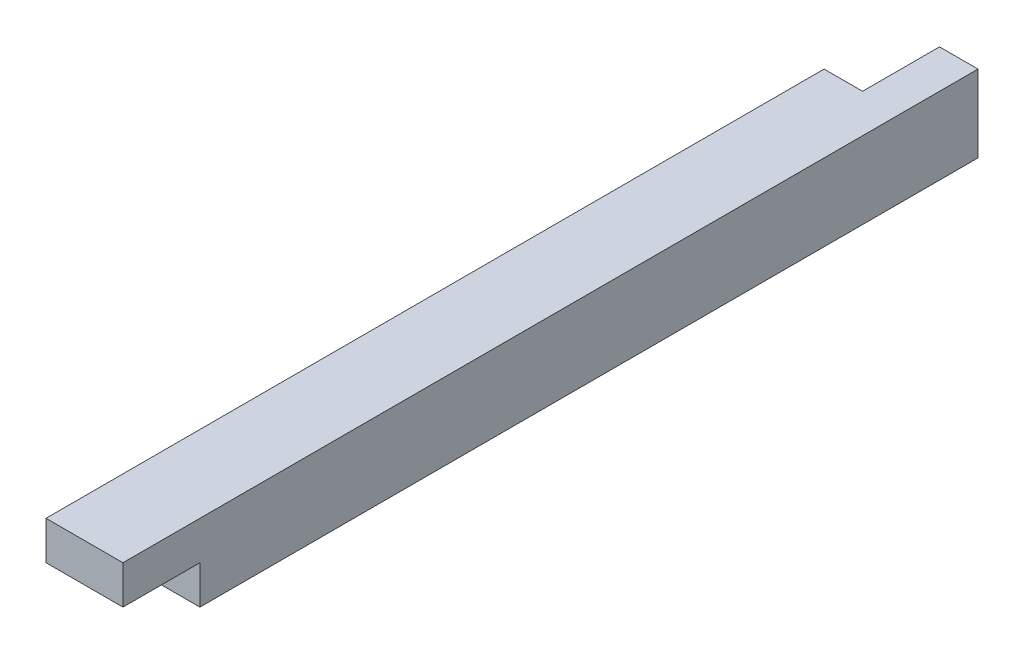
ISO-10303-21;
HEADER;
FILE_DESCRIPTION(('STEP AP214'),'2;1');
FILE_NAME('part.step','',(''),(''),'','','');
FILE_SCHEMA(('AUTOMOTIVE_DESIGN { 1 0 10303 214 1 1 1 1 }'));
ENDSEC;
DATA;
#1=APPLICATION_CONTEXT('core data for automotive mechanical design processes');
#2=APPLICATION_PROTOCOL_DEFINITION('international standard','automotive_design',2000,#1);
#3=PRODUCT_CONTEXT('',#1,'mechanical');
#4=PRODUCT('Part','Part','',(#3));
#5=PRODUCT_RELATED_PRODUCT_CATEGORY('part','',(#4));
#6=PRODUCT_DEFINITION_FORMATION('','',#4);
#7=PRODUCT_DEFINITION_CONTEXT('part definition',#1,'design');
#8=PRODUCT_DEFINITION('design','',#6,#7);
#9=PRODUCT_DEFINITION_SHAPE('','',#8);
#10=(LENGTH_UNIT() NAMED_UNIT(*) SI_UNIT(.MILLI.,.METRE.));
#11=(NAMED_UNIT(*) PLANE_ANGLE_UNIT() SI_UNIT($,.RADIAN.));
#12=(NAMED_UNIT(*) SI_UNIT($,.STERADIAN.) SOLID_ANGLE_UNIT());
#13=UNCERTAINTY_MEASURE_WITH_UNIT(LENGTH_MEASURE(1.E-05),#10,'distance_accuracy_value','');
#14=(GEOMETRIC_REPRESENTATION_CONTEXT(3) GLOBAL_UNCERTAINTY_ASSIGNED_CONTEXT((#13)) GLOBAL_UNIT_ASSIGNED_CONTEXT((#10,
#11,#12)) REPRESENTATION_CONTEXT('',''));
#15=CARTESIAN_POINT('',(0.,0.,0.));
#16=DIRECTION('',(0.,0.,1.));
#17=DIRECTION('',(1.,0.,0.));
#18=AXIS2_PLACEMENT_3D('',#15,#16,#17);
#19=CARTESIAN_POINT('',(0.,0.,1000.));
#20=DIRECTION('',(0.,0.,-1.));
#21=DIRECTION('',(-1.,0.,0.));
#22=AXIS2_PLACEMENT_3D('',#19,#20,#21);
#23=PLANE('',#22);
#24=DIRECTION('',(-1.,0.,0.));
#25=VECTOR('',#24,1.);
#26=CARTESIAN_POINT('',(0.,45.,1000.));
#27=LINE('',#26,#25);
#28=CARTESIAN_POINT('',(90.,45.,1000.));
#29=VERTEX_POINT('',#28);
#30=CARTESIAN_POINT('',(0.,45.,1000.));
#31=VERTEX_POINT('',#30);
#32=EDGE_CURVE('E167',#29,#31,#27,.T.);
#33=ORIENTED_EDGE('',*,*,#32,.F.);
#34=DIRECTION('',(0.,1.,0.));
#35=VECTOR('',#34,1.);
#36=CARTESIAN_POINT('',(90.,0.,1000.));
#37=LINE('',#36,#35);
#38=CARTESIAN_POINT('',(90.,90.,1000.));
#39=VERTEX_POINT('',#38);
#40=EDGE_CURVE('E171',#29,#39,#37,.T.);
#41=ORIENTED_EDGE('',*,*,#40,.T.);
#42=DIRECTION('',(-1.,0.,0.));
#43=VECTOR('',#42,1.);
#44=CARTESIAN_POINT('',(0.,90.,1000.));
#45=LINE('',#44,#43);
#46=CARTESIAN_POINT('',(0.,90.,1000.));
#47=VERTEX_POINT('',#46);
#48=EDGE_CURVE('E128',#39,#47,#45,.T.);
#49=ORIENTED_EDGE('',*,*,#48,.T.);
#50=DIRECTION('',(0.,-1.,0.));
#51=VECTOR('',#50,1.);
#52=CARTESIAN_POINT('',(0.,0.,1000.));
#53=LINE('',#52,#51);
#54=EDGE_CURVE('E132',#47,#31,#53,.T.);
#55=ORIENTED_EDGE('',*,*,#54,.T.);
#56=EDGE_LOOP('',(#33,#41,#49,#55));
#57=FACE_BOUND('',#56,.T.);
#58=ADVANCED_FACE('F33',(#57),#23,.F.);
#59=CARTESIAN_POINT('',(0.,0.,1000.));
#60=DIRECTION('',(1.,0.,0.));
#61=DIRECTION('',(0.,1.,0.));
#62=AXIS2_PLACEMENT_3D('',#59,#60,#61);
#63=PLANE('',#62);
#64=DIRECTION('',(0.,0.,-1.));
#65=VECTOR('',#64,1.);
#66=CARTESIAN_POINT('',(0.,90.,1000.));
#67=LINE('',#66,#65);
#68=CARTESIAN_POINT('',(0.,90.,90.));
#69=VERTEX_POINT('',#68);
#70=EDGE_CURVE('E133',#47,#69,#67,.T.);
#71=ORIENTED_EDGE('',*,*,#70,.T.);
#72=DIRECTION('',(0.,1.,0.));
#73=VECTOR('',#72,1.);
#74=CARTESIAN_POINT('',(0.,0.,90.));
#75=LINE('',#74,#73);
#76=CARTESIAN_POINT('',(0.,0.,90.));
#77=VERTEX_POINT('',#76);
#78=EDGE_CURVE('E107',#77,#69,#75,.T.);
#79=ORIENTED_EDGE('',*,*,#78,.F.);
#80=DIRECTION('',(0.,0.,-1.));
#81=VECTOR('',#80,1.);
#82=CARTESIAN_POINT('',(0.,0.,1000.));
#83=LINE('',#82,#81);
#84=CARTESIAN_POINT('',(0.,0.,910.));
#85=VERTEX_POINT('',#84);
#86=EDGE_CURVE('E11',#85,#77,#83,.T.);
#87=ORIENTED_EDGE('',*,*,#86,.F.);
#88=DIRECTION('',(0.,-1.,0.));
#89=VECTOR('',#88,1.);
#90=CARTESIAN_POINT('',(0.,45.,910.));
#91=LINE('',#90,#89);
#92=CARTESIAN_POINT('',(0.,45.,910.));
#93=VERTEX_POINT('',#92);
#94=EDGE_CURVE('E125',#93,#85,#91,.T.);
#95=ORIENTED_EDGE('',*,*,#94,.F.);
#96=DIRECTION('',(0.,0.,-1.));
#97=VECTOR('',#96,1.);
#98=CARTESIAN_POINT('',(0.,45.,1000.));
#99=LINE('',#98,#97);
#100=EDGE_CURVE('E145',#31,#93,#99,.T.);
#101=ORIENTED_EDGE('',*,*,#100,.F.);
#102=ORIENTED_EDGE('',*,*,#54,.F.);
#103=EDGE_LOOP('',(#71,#79,#87,#95,#101,#102));
#104=FACE_BOUND('',#103,.T.);
#105=ADVANCED_FACE('F35',(#104),#63,.F.);
#106=CARTESIAN_POINT('',(0.,0.,1000.));
#107=DIRECTION('',(0.,1.,0.));
#108=DIRECTION('',(0.,0.,1.));
#109=AXIS2_PLACEMENT_3D('',#106,#107,#108);
#110=PLANE('',#109);
#111=ORIENTED_EDGE('',*,*,#86,.T.);
#112=DIRECTION('',(-1.,0.,0.));
#113=VECTOR('',#112,1.);
#114=CARTESIAN_POINT('',(45.,0.,90.));
#115=LINE('',#114,#113);
#116=CARTESIAN_POINT('',(45.,0.,90.));
#117=VERTEX_POINT('',#116);
#118=EDGE_CURVE('E114',#117,#77,#115,.T.);
#119=ORIENTED_EDGE('',*,*,#118,.F.);
#120=DIRECTION('',(0.,0.,1.));
#121=VECTOR('',#120,1.);
#122=CARTESIAN_POINT('',(45.,0.,0.));
#123=LINE('',#122,#121);
#124=CARTESIAN_POINT('',(45.,0.,0.));
#125=VERTEX_POINT('',#124);
#126=EDGE_CURVE('E101',#125,#117,#123,.T.);
#127=ORIENTED_EDGE('',*,*,#126,.F.);
#128=DIRECTION('',(1.,0.,0.));
#129=VECTOR('',#128,1.);
#130=CARTESIAN_POINT('',(0.,0.,0.));
#131=LINE('',#130,#129);
#132=CARTESIAN_POINT('',(90.,0.,0.));
#133=VERTEX_POINT('',#132);
#134=EDGE_CURVE('E112',#125,#133,#131,.T.);
#135=ORIENTED_EDGE('',*,*,#134,.T.);
#136=DIRECTION('',(0.,0.,-1.));
#137=VECTOR('',#136,1.);
#138=CARTESIAN_POINT('',(90.,0.,1000.));
#139=LINE('',#138,#137);
#140=CARTESIAN_POINT('',(90.,0.,910.));
#141=VERTEX_POINT('',#140);
#142=EDGE_CURVE('E41',#141,#133,#139,.T.);
#143=ORIENTED_EDGE('',*,*,#142,.F.);
#144=DIRECTION('',(1.,0.,0.));
#145=VECTOR('',#144,1.);
#146=CARTESIAN_POINT('',(0.,0.,910.));
#147=LINE('',#146,#145);
#148=EDGE_CURVE('E142',#85,#141,#147,.T.);
#149=ORIENTED_EDGE('',*,*,#148,.F.);
#150=EDGE_LOOP('',(#111,#119,#127,#135,#143,#149));
#151=FACE_BOUND('',#150,.T.);
#152=ADVANCED_FACE('F110',(#151),#110,.F.);
#153=CARTESIAN_POINT('',(90.,0.,1000.));
#154=DIRECTION('',(-1.,0.,0.));
#155=DIRECTION('',(0.,-1.,0.));
#156=AXIS2_PLACEMENT_3D('',#153,#154,#155);
#157=PLANE('',#156);
#158=DIRECTION('',(0.,0.,1.));
#159=VECTOR('',#158,1.);
#160=CARTESIAN_POINT('',(90.,45.,1000.));
#161=LINE('',#160,#159);
#162=CARTESIAN_POINT('',(90.,45.,910.));
#163=VERTEX_POINT('',#162);
#164=EDGE_CURVE('E56',#163,#29,#161,.T.);
#165=ORIENTED_EDGE('',*,*,#164,.F.);
#166=DIRECTION('',(0.,-1.,0.));
#167=VECTOR('',#166,1.);
#168=CARTESIAN_POINT('',(90.,45.,910.));
#169=LINE('',#168,#167);
#170=EDGE_CURVE('E120',#163,#141,#169,.T.);
#171=ORIENTED_EDGE('',*,*,#170,.T.);
#172=ORIENTED_EDGE('',*,*,#142,.T.);
#173=DIRECTION('',(0.,1.,0.));
#174=VECTOR('',#173,1.);
#175=CARTESIAN_POINT('',(90.,0.,0.));
#176=LINE('',#175,#174);
#177=CARTESIAN_POINT('',(90.,90.,0.));
#178=VERTEX_POINT('',#177);
#179=EDGE_CURVE('E119',#133,#178,#176,.T.);
#180=ORIENTED_EDGE('',*,*,#179,.T.);
#181=DIRECTION('',(0.,0.,-1.));
#182=VECTOR('',#181,1.);
#183=CARTESIAN_POINT('',(90.,90.,1000.));
#184=LINE('',#183,#182);
#185=EDGE_CURVE('E136',#39,#178,#184,.T.);
#186=ORIENTED_EDGE('',*,*,#185,.F.);
#187=ORIENTED_EDGE('',*,*,#40,.F.);
#188=EDGE_LOOP('',(#165,#171,#172,#180,#186,#187));
#189=FACE_BOUND('',#188,.T.);
#190=ADVANCED_FACE('F139',(#189),#157,.F.);
#191=CARTESIAN_POINT('',(0.,90.,1000.));
#192=DIRECTION('',(0.,-1.,0.));
#193=DIRECTION('',(0.,0.,-1.));
#194=AXIS2_PLACEMENT_3D('',#191,#192,#193);
#195=PLANE('',#194);
#196=DIRECTION('',(0.,0.,-1.));
#197=VECTOR('',#196,1.);
#198=CARTESIAN_POINT('',(45.,90.,0.));
#199=LINE('',#198,#197);
#200=CARTESIAN_POINT('',(45.,90.,90.));
#201=VERTEX_POINT('',#200);
#202=CARTESIAN_POINT('',(45.,90.,0.));
#203=VERTEX_POINT('',#202);
#204=EDGE_CURVE('E48',#201,#203,#199,.T.);
#205=ORIENTED_EDGE('',*,*,#204,.F.);
#206=DIRECTION('',(-1.,0.,0.));
#207=VECTOR('',#206,1.);
#208=CARTESIAN_POINT('',(45.,90.,90.));
#209=LINE('',#208,#207);
#210=EDGE_CURVE('E146',#201,#69,#209,.T.);
#211=ORIENTED_EDGE('',*,*,#210,.T.);
#212=ORIENTED_EDGE('',*,*,#70,.F.);
#213=ORIENTED_EDGE('',*,*,#48,.F.);
#214=ORIENTED_EDGE('',*,*,#185,.T.);
#215=DIRECTION('',(-1.,0.,0.));
#216=VECTOR('',#215,1.);
#217=CARTESIAN_POINT('',(0.,90.,0.));
#218=LINE('',#217,#216);
#219=EDGE_CURVE('E122',#178,#203,#218,.T.);
#220=ORIENTED_EDGE('',*,*,#219,.T.);
#221=EDGE_LOOP('',(#205,#211,#212,#213,#214,#220));
#222=FACE_BOUND('',#221,.T.);
#223=ADVANCED_FACE('F176',(#222),#195,.F.);
#224=CARTESIAN_POINT('',(0.,0.,0.));
#225=DIRECTION('',(0.,0.,-1.));
#226=DIRECTION('',(-1.,0.,0.));
#227=AXIS2_PLACEMENT_3D('',#224,#225,#226);
#228=PLANE('',#227);
#229=DIRECTION('',(0.,-1.,0.));
#230=VECTOR('',#229,1.);
#231=CARTESIAN_POINT('',(45.,0.,0.));
#232=LINE('',#231,#230);
#233=EDGE_CURVE('E98',#203,#125,#232,.T.);
#234=ORIENTED_EDGE('',*,*,#233,.F.);
#235=ORIENTED_EDGE('',*,*,#219,.F.);
#236=ORIENTED_EDGE('',*,*,#179,.F.);
#237=ORIENTED_EDGE('',*,*,#134,.F.);
#238=EDGE_LOOP('',(#234,#235,#236,#237));
#239=FACE_BOUND('',#238,.T.);
#240=ADVANCED_FACE('F118',(#239),#228,.T.);
#241=CARTESIAN_POINT('',(0.,45.,910.));
#242=DIRECTION('',(0.,0.,-1.));
#243=DIRECTION('',(-1.,0.,0.));
#244=AXIS2_PLACEMENT_3D('',#241,#242,#243);
#245=PLANE('',#244);
#246=ORIENTED_EDGE('',*,*,#148,.T.);
#247=ORIENTED_EDGE('',*,*,#170,.F.);
#248=DIRECTION('',(1.,0.,0.));
#249=VECTOR('',#248,1.);
#250=CARTESIAN_POINT('',(0.,45.,910.));
#251=LINE('',#250,#249);
#252=EDGE_CURVE('E164',#93,#163,#251,.T.);
#253=ORIENTED_EDGE('',*,*,#252,.F.);
#254=ORIENTED_EDGE('',*,*,#94,.T.);
#255=EDGE_LOOP('',(#246,#247,#253,#254));
#256=FACE_BOUND('',#255,.T.);
#257=ADVANCED_FACE('F186',(#256),#245,.F.);
#258=CARTESIAN_POINT('',(0.,45.,0.));
#259=DIRECTION('',(0.,-1.,0.));
#260=DIRECTION('',(0.,0.,-1.));
#261=AXIS2_PLACEMENT_3D('',#258,#259,#260);
#262=PLANE('',#261);
#263=ORIENTED_EDGE('',*,*,#100,.T.);
#264=ORIENTED_EDGE('',*,*,#252,.T.);
#265=ORIENTED_EDGE('',*,*,#164,.T.);
#266=ORIENTED_EDGE('',*,*,#32,.T.);
#267=EDGE_LOOP('',(#263,#264,#265,#266));
#268=FACE_BOUND('',#267,.T.);
#269=ADVANCED_FACE('F177',(#268),#262,.T.);
#270=CARTESIAN_POINT('',(45.,0.,90.));
#271=DIRECTION('',(0.,0.,1.));
#272=DIRECTION('',(1.,0.,0.));
#273=AXIS2_PLACEMENT_3D('',#270,#271,#272);
#274=PLANE('',#273);
#275=ORIENTED_EDGE('',*,*,#78,.T.);
#276=ORIENTED_EDGE('',*,*,#210,.F.);
#277=DIRECTION('',(0.,1.,0.));
#278=VECTOR('',#277,1.);
#279=CARTESIAN_POINT('',(45.,0.,90.));
#280=LINE('',#279,#278);
#281=EDGE_CURVE('E115',#117,#201,#280,.T.);
#282=ORIENTED_EDGE('',*,*,#281,.F.);
#283=ORIENTED_EDGE('',*,*,#118,.T.);
#284=EDGE_LOOP('',(#275,#276,#282,#283));
#285=FACE_BOUND('',#284,.T.);
#286=ADVANCED_FACE('F178',(#285),#274,.F.);
#287=CARTESIAN_POINT('',(45.,0.,0.));
#288=DIRECTION('',(1.,0.,0.));
#289=DIRECTION('',(0.,1.,0.));
#290=AXIS2_PLACEMENT_3D('',#287,#288,#289);
#291=PLANE('',#290);
#292=ORIENTED_EDGE('',*,*,#233,.T.);
#293=ORIENTED_EDGE('',*,*,#126,.T.);
#294=ORIENTED_EDGE('',*,*,#281,.T.);
#295=ORIENTED_EDGE('',*,*,#204,.T.);
#296=EDGE_LOOP('',(#292,#293,#294,#295));
#297=FACE_BOUND('',#296,.T.);
#298=ADVANCED_FACE('F100',(#297),#291,.F.);
#299=CLOSED_SHELL('',(#58,#105,#152,#190,#223,#240,#257,#269,#286,#298));
#300=MANIFOLD_SOLID_BREP('B2',#299);
#301=ADVANCED_BREP_SHAPE_REPRESENTATION('',(#18,#300),#14);
#302=SHAPE_DEFINITION_REPRESENTATION(#9,#301);
ENDSEC;
END-ISO-10303-21;
